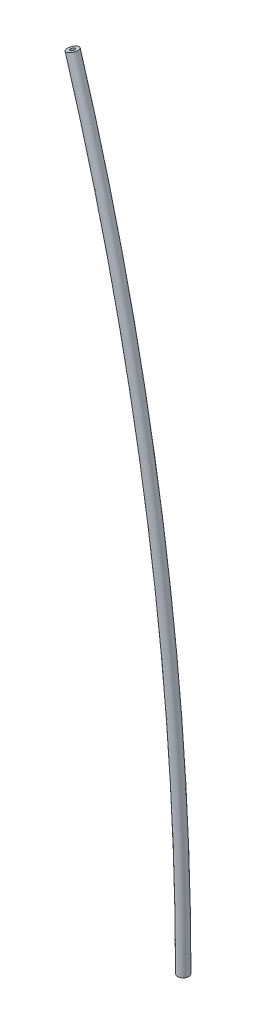
ISO-10303-21;
HEADER;
FILE_DESCRIPTION(('STEP AP214'),'2;1');
FILE_NAME('part.step','',(''),(''),'','','');
FILE_SCHEMA(('AUTOMOTIVE_DESIGN { 1 0 10303 214 1 1 1 1 }'));
ENDSEC;
DATA;
#1=APPLICATION_CONTEXT('core data for automotive mechanical design processes');
#2=APPLICATION_PROTOCOL_DEFINITION('international standard','automotive_design',2000,#1);
#3=PRODUCT_CONTEXT('',#1,'mechanical');
#4=PRODUCT('Part','Part','',(#3));
#5=PRODUCT_RELATED_PRODUCT_CATEGORY('part','',(#4));
#6=PRODUCT_DEFINITION_FORMATION('','',#4);
#7=PRODUCT_DEFINITION_CONTEXT('part definition',#1,'design');
#8=PRODUCT_DEFINITION('design','',#6,#7);
#9=PRODUCT_DEFINITION_SHAPE('','',#8);
#10=(LENGTH_UNIT() NAMED_UNIT(*) SI_UNIT(.MILLI.,.METRE.));
#11=(NAMED_UNIT(*) PLANE_ANGLE_UNIT() SI_UNIT($,.RADIAN.));
#12=(NAMED_UNIT(*) SI_UNIT($,.STERADIAN.) SOLID_ANGLE_UNIT());
#13=UNCERTAINTY_MEASURE_WITH_UNIT(LENGTH_MEASURE(1.E-05),#10,'distance_accuracy_value','');
#14=(GEOMETRIC_REPRESENTATION_CONTEXT(3) GLOBAL_UNCERTAINTY_ASSIGNED_CONTEXT((#13)) GLOBAL_UNIT_ASSIGNED_CONTEXT((#10,
#11,#12)) REPRESENTATION_CONTEXT('',''));
#15=CARTESIAN_POINT('',(0.,0.,0.));
#16=DIRECTION('',(0.,0.,1.));
#17=DIRECTION('',(1.,0.,0.));
#18=AXIS2_PLACEMENT_3D('',#15,#16,#17);
#19=CARTESIAN_POINT('',(0.,0.,0.));
#20=DIRECTION('',(0.,0.,-1.));
#21=DIRECTION('',(-1.,0.,0.));
#22=AXIS2_PLACEMENT_3D('',#19,#20,#21);
#23=TOROIDAL_SURFACE('',#22,610.973470510679,1.30163925196174);
#24=CARTESIAN_POINT('',(584.625298657555,177.487582206273,0.));
#25=DIRECTION('',(-0.290499654687004,0.956875096669744,0.));
#26=DIRECTION('',(0.,0.,1.));
#27=AXIS2_PLACEMENT_3D('',#24,#25,#26);
#28=CIRCLE('',#27,1.30163925196174);
#29=CARTESIAN_POINT('',(585.870804842605,177.865707959495,0.));
#30=VERTEX_POINT('',#29);
#31=EDGE_CURVE('E10',#30,#30,#28,.T.);
#32=CARTESIAN_POINT('',(610.973470510679,0.,0.));
#33=DIRECTION('',(0.,1.,0.));
#34=DIRECTION('',(0.,0.,1.));
#35=AXIS2_PLACEMENT_3D('',#32,#33,#34);
#36=CIRCLE('',#35,1.30163925196174);
#37=CARTESIAN_POINT('',(612.275109762641,0.,0.));
#38=VERTEX_POINT('',#37);
#39=EDGE_CURVE('E36',#38,#38,#36,.T.);
#40=CARTESIAN_POINT('',(0.,0.,0.));
#41=DIRECTION('',(0.,0.,-1.));
#42=DIRECTION('',(-1.,0.,0.));
#43=AXIS2_PLACEMENT_3D('',#40,#41,#42);
#44=CIRCLE('',#43,612.275109762641);
#45=EDGE_CURVE('',#30,#38,#44,.T.);
#46=ORIENTED_EDGE('',*,*,#31,.F.);
#47=ORIENTED_EDGE('',*,*,#39,.T.);
#48=ORIENTED_EDGE('',*,*,#45,.T.);
#49=ORIENTED_EDGE('',*,*,#45,.F.);
#50=EDGE_LOOP('',(#46,#48,#47,#49));
#51=FACE_BOUND('',#50,.T.);
#52=ADVANCED_FACE('F30',(#51),#23,.T.);
#53=CARTESIAN_POINT('',(584.625298657555,177.487582206273,0.));
#54=DIRECTION('',(-0.290499654687004,0.956875096669744,0.));
#55=DIRECTION('',(0.,0.,1.));
#56=AXIS2_PLACEMENT_3D('',#53,#54,#55);
#57=PLANE('',#56);
#58=CARTESIAN_POINT('',(584.625298657555,177.487582206273,0.));
#59=DIRECTION('',(-0.290499654687004,0.956875096669744,0.));
#60=DIRECTION('',(-0.956875096669744,-0.290499654687004,0.));
#61=AXIS2_PLACEMENT_3D('',#58,#59,#60);
#62=CIRCLE('',#61,0.539639251961735);
#63=CARTESIAN_POINT('',(585.141666018942,177.644347222623,0.));
#64=VERTEX_POINT('',#63);
#65=EDGE_CURVE('E40',#64,#64,#62,.T.);
#66=ORIENTED_EDGE('',*,*,#65,.F.);
#67=EDGE_LOOP('',(#66));
#68=FACE_BOUND('',#67,.T.);
#69=ORIENTED_EDGE('',*,*,#31,.T.);
#70=EDGE_LOOP('',(#69));
#71=FACE_BOUND('',#70,.T.);
#72=ADVANCED_FACE('F60',(#68,#71),#57,.T.);
#73=CARTESIAN_POINT('',(610.973470510679,0.,0.));
#74=DIRECTION('',(0.,1.,0.));
#75=DIRECTION('',(0.,0.,1.));
#76=AXIS2_PLACEMENT_3D('',#73,#74,#75);
#77=PLANE('',#76);
#78=CARTESIAN_POINT('',(610.973470510679,0.,0.));
#79=DIRECTION('',(0.,1.,0.));
#80=DIRECTION('',(0.,0.,1.));
#81=AXIS2_PLACEMENT_3D('',#78,#79,#80);
#82=CIRCLE('',#81,0.539639251961735);
#83=CARTESIAN_POINT('',(611.513109762641,0.,0.));
#84=VERTEX_POINT('',#83);
#85=EDGE_CURVE('E44',#84,#84,#82,.T.);
#86=ORIENTED_EDGE('',*,*,#85,.T.);
#87=EDGE_LOOP('',(#86));
#88=FACE_BOUND('',#87,.T.);
#89=ORIENTED_EDGE('',*,*,#39,.F.);
#90=EDGE_LOOP('',(#89));
#91=FACE_BOUND('',#90,.T.);
#92=ADVANCED_FACE('F50',(#88,#91),#77,.F.);
#93=CARTESIAN_POINT('',(0.,0.,0.));
#94=DIRECTION('',(0.,0.,-1.));
#95=DIRECTION('',(-1.,0.,0.));
#96=AXIS2_PLACEMENT_3D('',#93,#94,#95);
#97=TOROIDAL_SURFACE('',#96,610.973470510679,0.539639251961735);
#98=CARTESIAN_POINT('',(0.,0.,0.));
#99=DIRECTION('',(0.,0.,-1.));
#100=DIRECTION('',(-1.,0.,0.));
#101=AXIS2_PLACEMENT_3D('',#98,#99,#100);
#102=CIRCLE('',#101,611.513109762641);
#103=EDGE_CURVE('',#64,#84,#102,.T.);
#104=ORIENTED_EDGE('',*,*,#65,.T.);
#105=ORIENTED_EDGE('',*,*,#85,.F.);
#106=ORIENTED_EDGE('',*,*,#103,.T.);
#107=ORIENTED_EDGE('',*,*,#103,.F.);
#108=EDGE_LOOP('',(#104,#106,#105,#107));
#109=FACE_BOUND('',#108,.T.);
#110=ADVANCED_FACE('F53',(#109),#97,.F.);
#111=CLOSED_SHELL('',(#52,#72,#92,#110));
#112=MANIFOLD_SOLID_BREP('B2',#111);
#113=ADVANCED_BREP_SHAPE_REPRESENTATION('',(#18,#112),#14);
#114=SHAPE_DEFINITION_REPRESENTATION(#9,#113);
ENDSEC;
END-ISO-10303-21;
